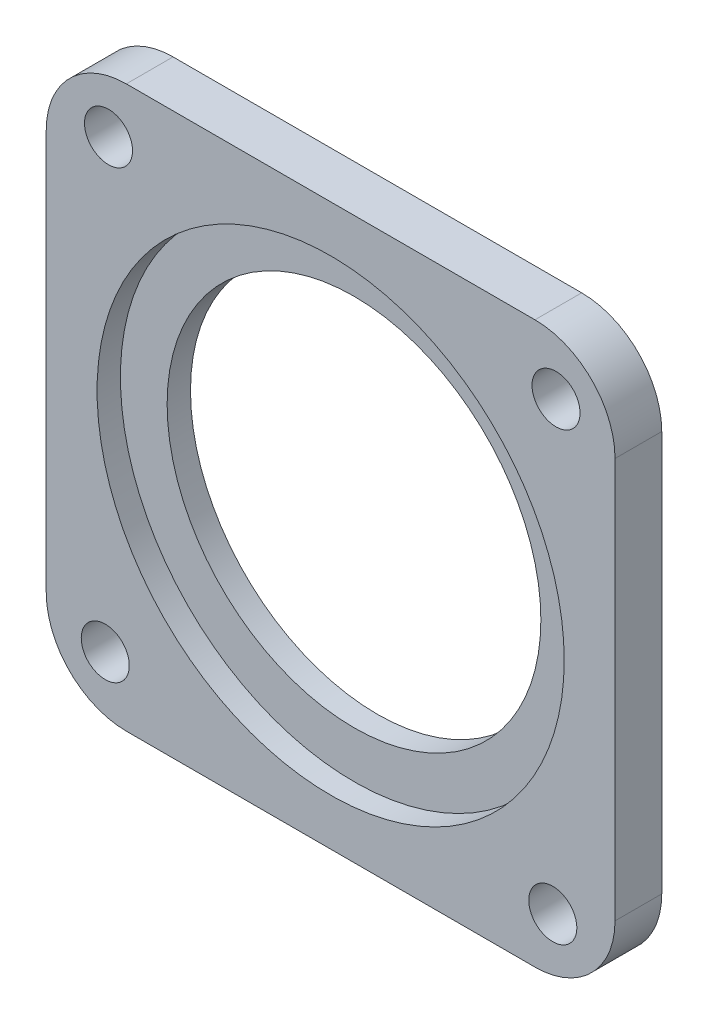
ISO-10303-21;
HEADER;
FILE_DESCRIPTION(('STEP AP214'),'2;1');
FILE_NAME('part.step','',(''),(''),'','','');
FILE_SCHEMA(('AUTOMOTIVE_DESIGN { 1 0 10303 214 1 1 1 1 }'));
ENDSEC;
DATA;
#1=APPLICATION_CONTEXT('core data for automotive mechanical design processes');
#2=APPLICATION_PROTOCOL_DEFINITION('international standard','automotive_design',2000,#1);
#3=PRODUCT_CONTEXT('',#1,'mechanical');
#4=PRODUCT('Part','Part','',(#3));
#5=PRODUCT_RELATED_PRODUCT_CATEGORY('part','',(#4));
#6=PRODUCT_DEFINITION_FORMATION('','',#4);
#7=PRODUCT_DEFINITION_CONTEXT('part definition',#1,'design');
#8=PRODUCT_DEFINITION('design','',#6,#7);
#9=PRODUCT_DEFINITION_SHAPE('','',#8);
#10=(LENGTH_UNIT() NAMED_UNIT(*) SI_UNIT(.MILLI.,.METRE.));
#11=(NAMED_UNIT(*) PLANE_ANGLE_UNIT() SI_UNIT($,.RADIAN.));
#12=(NAMED_UNIT(*) SI_UNIT($,.STERADIAN.) SOLID_ANGLE_UNIT());
#13=UNCERTAINTY_MEASURE_WITH_UNIT(LENGTH_MEASURE(1.E-05),#10,'distance_accuracy_value','');
#14=(GEOMETRIC_REPRESENTATION_CONTEXT(3) GLOBAL_UNCERTAINTY_ASSIGNED_CONTEXT((#13)) GLOBAL_UNIT_ASSIGNED_CONTEXT((#10,
#11,#12)) REPRESENTATION_CONTEXT('',''));
#15=CARTESIAN_POINT('',(0.,0.,0.));
#16=DIRECTION('',(0.,0.,1.));
#17=DIRECTION('',(1.,0.,0.));
#18=AXIS2_PLACEMENT_3D('',#15,#16,#17);
#19=CARTESIAN_POINT('',(0.,0.,3.5));
#20=DIRECTION('',(0.,0.,-1.));
#21=DIRECTION('',(-1.,0.,0.));
#22=AXIS2_PLACEMENT_3D('',#19,#20,#21);
#23=CYLINDRICAL_SURFACE('',#22,14.);
#24=CARTESIAN_POINT('',(0.,0.,0.));
#25=DIRECTION('',(0.,0.,1.));
#26=DIRECTION('',(1.,0.,0.));
#27=AXIS2_PLACEMENT_3D('',#24,#25,#26);
#28=CIRCLE('',#27,14.);
#29=CARTESIAN_POINT('',(14.,0.,0.));
#30=VERTEX_POINT('',#29);
#31=EDGE_CURVE('E127',#30,#30,#28,.T.);
#32=ORIENTED_EDGE('',*,*,#31,.F.);
#33=EDGE_LOOP('',(#32));
#34=FACE_BOUND('',#33,.T.);
#35=CARTESIAN_POINT('',(0.,0.,1.75));
#36=DIRECTION('',(0.,0.,1.));
#37=DIRECTION('',(1.,0.,0.));
#38=AXIS2_PLACEMENT_3D('',#35,#36,#37);
#39=CIRCLE('',#38,14.);
#40=CARTESIAN_POINT('',(14.,0.,1.75));
#41=VERTEX_POINT('',#40);
#42=EDGE_CURVE('E133',#41,#41,#39,.T.);
#43=ORIENTED_EDGE('',*,*,#42,.T.);
#44=EDGE_LOOP('',(#43));
#45=FACE_BOUND('',#44,.T.);
#46=ADVANCED_FACE('F33',(#34,#45),#23,.F.);
#47=CARTESIAN_POINT('',(0.,0.,3.5));
#48=DIRECTION('',(0.,0.,1.));
#49=DIRECTION('',(1.,0.,0.));
#50=AXIS2_PLACEMENT_3D('',#47,#48,#49);
#51=PLANE('',#50);
#52=CARTESIAN_POINT('',(16.8856216883251,16.6420790678204,3.5));
#53=DIRECTION('',(0.,0.,-1.));
#54=DIRECTION('',(-1.,0.,0.));
#55=AXIS2_PLACEMENT_3D('',#52,#53,#54);
#56=CIRCLE('',#55,1.8);
#57=CARTESIAN_POINT('',(15.0856216883251,16.6420790678204,3.5));
#58=VERTEX_POINT('',#57);
#59=EDGE_CURVE('E206',#58,#58,#56,.T.);
#60=ORIENTED_EDGE('',*,*,#59,.T.);
#61=EDGE_LOOP('',(#60));
#62=FACE_BOUND('',#61,.T.);
#63=CARTESIAN_POINT('',(-16.6420790678204,16.8856216883261,3.5));
#64=DIRECTION('',(0.,0.,-1.));
#65=DIRECTION('',(-1.,0.,0.));
#66=AXIS2_PLACEMENT_3D('',#63,#64,#65);
#67=CIRCLE('',#66,1.8);
#68=CARTESIAN_POINT('',(-18.4420790678204,16.8856216883261,3.5));
#69=VERTEX_POINT('',#68);
#70=EDGE_CURVE('E200',#69,#69,#67,.T.);
#71=ORIENTED_EDGE('',*,*,#70,.T.);
#72=EDGE_LOOP('',(#71));
#73=FACE_BOUND('',#72,.T.);
#74=CARTESIAN_POINT('',(-16.8856216883261,-16.6420790678195,3.5));
#75=DIRECTION('',(0.,0.,-1.));
#76=DIRECTION('',(-1.,0.,0.));
#77=AXIS2_PLACEMENT_3D('',#74,#75,#76);
#78=CIRCLE('',#77,1.8);
#79=CARTESIAN_POINT('',(-18.6856216883261,-16.6420790678195,3.5));
#80=VERTEX_POINT('',#79);
#81=EDGE_CURVE('E194',#80,#80,#78,.T.);
#82=ORIENTED_EDGE('',*,*,#81,.T.);
#83=EDGE_LOOP('',(#82));
#84=FACE_BOUND('',#83,.T.);
#85=CARTESIAN_POINT('',(16.6420790678195,-16.8856216883251,3.5));
#86=DIRECTION('',(0.,0.,-1.));
#87=DIRECTION('',(-1.,0.,0.));
#88=AXIS2_PLACEMENT_3D('',#85,#86,#87);
#89=CIRCLE('',#88,1.8);
#90=CARTESIAN_POINT('',(14.8420790678195,-16.8856216883251,3.5));
#91=VERTEX_POINT('',#90);
#92=EDGE_CURVE('E186',#91,#91,#89,.T.);
#93=ORIENTED_EDGE('',*,*,#92,.T.);
#94=EDGE_LOOP('',(#93));
#95=FACE_BOUND('',#94,.T.);
#96=CARTESIAN_POINT('',(0.,0.,3.5));
#97=DIRECTION('',(0.,0.,1.));
#98=DIRECTION('',(1.,0.,0.));
#99=AXIS2_PLACEMENT_3D('',#96,#97,#98);
#100=CIRCLE('',#99,17.5);
#101=CARTESIAN_POINT('',(17.5,0.,3.5));
#102=VERTEX_POINT('',#101);
#103=EDGE_CURVE('E183',#102,#102,#100,.T.);
#104=ORIENTED_EDGE('',*,*,#103,.F.);
#105=EDGE_LOOP('',(#104));
#106=FACE_BOUND('',#105,.T.);
#107=DIRECTION('',(-1.,0.,0.));
#108=VECTOR('',#107,1.);
#109=CARTESIAN_POINT('',(21.3073170731708,21.,3.5));
#110=LINE('',#109,#108);
#111=CARTESIAN_POINT('',(15.3073170731708,21.,3.5));
#112=VERTEX_POINT('',#111);
#113=CARTESIAN_POINT('',(-15.3073170731708,21.,3.5));
#114=VERTEX_POINT('',#113);
#115=EDGE_CURVE('E136',#112,#114,#110,.T.);
#116=ORIENTED_EDGE('',*,*,#115,.T.);
#117=CARTESIAN_POINT('',(-15.3073170731708,15.,3.5));
#118=DIRECTION('',(0.,0.,1.));
#119=DIRECTION('',(1.,0.,0.));
#120=AXIS2_PLACEMENT_3D('',#117,#118,#119);
#121=CIRCLE('',#120,6.);
#122=CARTESIAN_POINT('',(-21.3073170731708,15.,3.5));
#123=VERTEX_POINT('',#122);
#124=EDGE_CURVE('E158',#114,#123,#121,.T.);
#125=ORIENTED_EDGE('',*,*,#124,.T.);
#126=DIRECTION('',(0.,-1.,0.));
#127=VECTOR('',#126,1.);
#128=CARTESIAN_POINT('',(-21.3073170731708,-21.,3.5));
#129=LINE('',#128,#127);
#130=CARTESIAN_POINT('',(-21.3073170731708,-15.,3.5));
#131=VERTEX_POINT('',#130);
#132=EDGE_CURVE('E119',#123,#131,#129,.T.);
#133=ORIENTED_EDGE('',*,*,#132,.T.);
#134=CARTESIAN_POINT('',(-15.3073170731708,-15.,3.5));
#135=DIRECTION('',(0.,0.,1.));
#136=DIRECTION('',(1.,0.,0.));
#137=AXIS2_PLACEMENT_3D('',#134,#135,#136);
#138=CIRCLE('',#137,6.);
#139=CARTESIAN_POINT('',(-15.3073170731708,-21.,3.5));
#140=VERTEX_POINT('',#139);
#141=EDGE_CURVE('E156',#131,#140,#138,.T.);
#142=ORIENTED_EDGE('',*,*,#141,.T.);
#143=DIRECTION('',(1.,0.,0.));
#144=VECTOR('',#143,1.);
#145=CARTESIAN_POINT('',(21.3073170731708,-21.,3.5));
#146=LINE('',#145,#144);
#147=CARTESIAN_POINT('',(15.3073170731708,-21.,3.5));
#148=VERTEX_POINT('',#147);
#149=EDGE_CURVE('E169',#140,#148,#146,.T.);
#150=ORIENTED_EDGE('',*,*,#149,.T.);
#151=CARTESIAN_POINT('',(15.3073170731708,-15.,3.5));
#152=DIRECTION('',(0.,0.,1.));
#153=DIRECTION('',(1.,0.,0.));
#154=AXIS2_PLACEMENT_3D('',#151,#152,#153);
#155=CIRCLE('',#154,6.);
#156=CARTESIAN_POINT('',(21.3073170731708,-15.,3.5));
#157=VERTEX_POINT('',#156);
#158=EDGE_CURVE('E54',#148,#157,#155,.T.);
#159=ORIENTED_EDGE('',*,*,#158,.T.);
#160=DIRECTION('',(0.,1.,0.));
#161=VECTOR('',#160,1.);
#162=CARTESIAN_POINT('',(21.3073170731708,-21.,3.5));
#163=LINE('',#162,#161);
#164=CARTESIAN_POINT('',(21.3073170731708,15.,3.5));
#165=VERTEX_POINT('',#164);
#166=EDGE_CURVE('E177',#157,#165,#163,.T.);
#167=ORIENTED_EDGE('',*,*,#166,.T.);
#168=CARTESIAN_POINT('',(15.3073170731708,15.,3.5));
#169=DIRECTION('',(0.,0.,1.));
#170=DIRECTION('',(1.,0.,0.));
#171=AXIS2_PLACEMENT_3D('',#168,#169,#170);
#172=CIRCLE('',#171,6.);
#173=EDGE_CURVE('E153',#165,#112,#172,.T.);
#174=ORIENTED_EDGE('',*,*,#173,.T.);
#175=EDGE_LOOP('',(#116,#125,#133,#142,#150,#159,#167,#174));
#176=FACE_BOUND('',#175,.T.);
#177=ADVANCED_FACE('F217',(#62,#73,#84,#95,#106,#176),#51,.T.);
#178=CARTESIAN_POINT('',(0.,0.,0.));
#179=DIRECTION('',(0.,0.,1.));
#180=DIRECTION('',(1.,0.,0.));
#181=AXIS2_PLACEMENT_3D('',#178,#179,#180);
#182=PLANE('',#181);
#183=CARTESIAN_POINT('',(16.8856216883251,16.6420790678204,0.));
#184=DIRECTION('',(0.,0.,-1.));
#185=DIRECTION('',(-1.,0.,0.));
#186=AXIS2_PLACEMENT_3D('',#183,#184,#185);
#187=CIRCLE('',#186,1.8);
#188=CARTESIAN_POINT('',(15.0856216883251,16.6420790678204,0.));
#189=VERTEX_POINT('',#188);
#190=EDGE_CURVE('E209',#189,#189,#187,.T.);
#191=ORIENTED_EDGE('',*,*,#190,.F.);
#192=EDGE_LOOP('',(#191));
#193=FACE_BOUND('',#192,.T.);
#194=CARTESIAN_POINT('',(-16.6420790678204,16.8856216883261,0.));
#195=DIRECTION('',(0.,0.,-1.));
#196=DIRECTION('',(-1.,0.,0.));
#197=AXIS2_PLACEMENT_3D('',#194,#195,#196);
#198=CIRCLE('',#197,1.8);
#199=CARTESIAN_POINT('',(-18.4420790678204,16.8856216883261,0.));
#200=VERTEX_POINT('',#199);
#201=EDGE_CURVE('E203',#200,#200,#198,.T.);
#202=ORIENTED_EDGE('',*,*,#201,.F.);
#203=EDGE_LOOP('',(#202));
#204=FACE_BOUND('',#203,.T.);
#205=CARTESIAN_POINT('',(-16.8856216883261,-16.6420790678195,0.));
#206=DIRECTION('',(0.,0.,-1.));
#207=DIRECTION('',(-1.,0.,0.));
#208=AXIS2_PLACEMENT_3D('',#205,#206,#207);
#209=CIRCLE('',#208,1.8);
#210=CARTESIAN_POINT('',(-18.6856216883261,-16.6420790678195,0.));
#211=VERTEX_POINT('',#210);
#212=EDGE_CURVE('E197',#211,#211,#209,.T.);
#213=ORIENTED_EDGE('',*,*,#212,.F.);
#214=EDGE_LOOP('',(#213));
#215=FACE_BOUND('',#214,.T.);
#216=CARTESIAN_POINT('',(16.6420790678195,-16.8856216883251,0.));
#217=DIRECTION('',(0.,0.,-1.));
#218=DIRECTION('',(-1.,0.,0.));
#219=AXIS2_PLACEMENT_3D('',#216,#217,#218);
#220=CIRCLE('',#219,1.8);
#221=CARTESIAN_POINT('',(14.8420790678195,-16.8856216883251,0.));
#222=VERTEX_POINT('',#221);
#223=EDGE_CURVE('E191',#222,#222,#220,.T.);
#224=ORIENTED_EDGE('',*,*,#223,.F.);
#225=EDGE_LOOP('',(#224));
#226=FACE_BOUND('',#225,.T.);
#227=DIRECTION('',(0.,-1.,0.));
#228=VECTOR('',#227,1.);
#229=CARTESIAN_POINT('',(-21.3073170731708,-21.,0.));
#230=LINE('',#229,#228);
#231=CARTESIAN_POINT('',(-21.3073170731708,15.,0.));
#232=VERTEX_POINT('',#231);
#233=CARTESIAN_POINT('',(-21.3073170731708,-15.,0.));
#234=VERTEX_POINT('',#233);
#235=EDGE_CURVE('E116',#232,#234,#230,.T.);
#236=ORIENTED_EDGE('',*,*,#235,.F.);
#237=CARTESIAN_POINT('',(-15.3073170731708,15.,0.));
#238=DIRECTION('',(0.,0.,1.));
#239=DIRECTION('',(1.,0.,0.));
#240=AXIS2_PLACEMENT_3D('',#237,#238,#239);
#241=CIRCLE('',#240,6.);
#242=CARTESIAN_POINT('',(-15.3073170731708,21.,0.));
#243=VERTEX_POINT('',#242);
#244=EDGE_CURVE('E99',#232,#243,#241,.F.);
#245=ORIENTED_EDGE('',*,*,#244,.T.);
#246=DIRECTION('',(-1.,0.,0.));
#247=VECTOR('',#246,1.);
#248=CARTESIAN_POINT('',(21.3073170731708,21.,0.));
#249=LINE('',#248,#247);
#250=CARTESIAN_POINT('',(15.3073170731708,21.,0.));
#251=VERTEX_POINT('',#250);
#252=EDGE_CURVE('E140',#251,#243,#249,.T.);
#253=ORIENTED_EDGE('',*,*,#252,.F.);
#254=CARTESIAN_POINT('',(15.3073170731708,15.,0.));
#255=DIRECTION('',(0.,0.,1.));
#256=DIRECTION('',(1.,0.,0.));
#257=AXIS2_PLACEMENT_3D('',#254,#255,#256);
#258=CIRCLE('',#257,6.);
#259=CARTESIAN_POINT('',(21.3073170731708,15.,0.));
#260=VERTEX_POINT('',#259);
#261=EDGE_CURVE('E120',#251,#260,#258,.F.);
#262=ORIENTED_EDGE('',*,*,#261,.T.);
#263=DIRECTION('',(0.,1.,0.));
#264=VECTOR('',#263,1.);
#265=CARTESIAN_POINT('',(21.3073170731708,-21.,0.));
#266=LINE('',#265,#264);
#267=CARTESIAN_POINT('',(21.3073170731708,-15.,0.));
#268=VERTEX_POINT('',#267);
#269=EDGE_CURVE('E130',#268,#260,#266,.T.);
#270=ORIENTED_EDGE('',*,*,#269,.F.);
#271=CARTESIAN_POINT('',(15.3073170731708,-15.,0.));
#272=DIRECTION('',(0.,0.,1.));
#273=DIRECTION('',(1.,0.,0.));
#274=AXIS2_PLACEMENT_3D('',#271,#272,#273);
#275=CIRCLE('',#274,6.);
#276=CARTESIAN_POINT('',(15.3073170731708,-21.,0.));
#277=VERTEX_POINT('',#276);
#278=EDGE_CURVE('E147',#268,#277,#275,.F.);
#279=ORIENTED_EDGE('',*,*,#278,.T.);
#280=DIRECTION('',(1.,0.,0.));
#281=VECTOR('',#280,1.);
#282=CARTESIAN_POINT('',(21.3073170731708,-21.,0.));
#283=LINE('',#282,#281);
#284=CARTESIAN_POINT('',(-15.3073170731708,-21.,0.));
#285=VERTEX_POINT('',#284);
#286=EDGE_CURVE('E126',#285,#277,#283,.T.);
#287=ORIENTED_EDGE('',*,*,#286,.F.);
#288=CARTESIAN_POINT('',(-15.3073170731708,-15.,0.));
#289=DIRECTION('',(0.,0.,1.));
#290=DIRECTION('',(1.,0.,0.));
#291=AXIS2_PLACEMENT_3D('',#288,#289,#290);
#292=CIRCLE('',#291,6.);
#293=EDGE_CURVE('E110',#285,#234,#292,.F.);
#294=ORIENTED_EDGE('',*,*,#293,.T.);
#295=EDGE_LOOP('',(#236,#245,#253,#262,#270,#279,#287,#294));
#296=FACE_BOUND('',#295,.T.);
#297=ORIENTED_EDGE('',*,*,#31,.T.);
#298=EDGE_LOOP('',(#297));
#299=FACE_BOUND('',#298,.T.);
#300=ADVANCED_FACE('F123',(#193,#204,#215,#226,#296,#299),#182,.F.);
#301=CARTESIAN_POINT('',(-21.3073170731708,-21.,3.5));
#302=DIRECTION('',(1.,0.,0.));
#303=DIRECTION('',(0.,0.,-1.));
#304=AXIS2_PLACEMENT_3D('',#301,#302,#303);
#305=PLANE('',#304);
#306=ORIENTED_EDGE('',*,*,#132,.F.);
#307=DIRECTION('',(0.,0.,-1.));
#308=VECTOR('',#307,1.);
#309=CARTESIAN_POINT('',(-21.3073170731708,15.,3.5));
#310=LINE('',#309,#308);
#311=EDGE_CURVE('E103',#123,#232,#310,.T.);
#312=ORIENTED_EDGE('',*,*,#311,.T.);
#313=ORIENTED_EDGE('',*,*,#235,.T.);
#314=DIRECTION('',(0.,0.,-1.));
#315=VECTOR('',#314,1.);
#316=CARTESIAN_POINT('',(-21.3073170731708,-15.,3.5));
#317=LINE('',#316,#315);
#318=EDGE_CURVE('E121',#234,#131,#317,.F.);
#319=ORIENTED_EDGE('',*,*,#318,.T.);
#320=EDGE_LOOP('',(#306,#312,#313,#319));
#321=FACE_BOUND('',#320,.T.);
#322=ADVANCED_FACE('F115',(#321),#305,.F.);
#323=CARTESIAN_POINT('',(21.3073170731708,-21.,3.5));
#324=DIRECTION('',(0.,1.,0.));
#325=DIRECTION('',(-1.,0.,0.));
#326=AXIS2_PLACEMENT_3D('',#323,#324,#325);
#327=PLANE('',#326);
#328=ORIENTED_EDGE('',*,*,#149,.F.);
#329=DIRECTION('',(0.,0.,-1.));
#330=VECTOR('',#329,1.);
#331=CARTESIAN_POINT('',(-15.3073170731708,-21.,3.5));
#332=LINE('',#331,#330);
#333=EDGE_CURVE('E162',#140,#285,#332,.T.);
#334=ORIENTED_EDGE('',*,*,#333,.T.);
#335=ORIENTED_EDGE('',*,*,#286,.T.);
#336=DIRECTION('',(0.,0.,-1.));
#337=VECTOR('',#336,1.);
#338=CARTESIAN_POINT('',(15.3073170731708,-21.,3.5));
#339=LINE('',#338,#337);
#340=EDGE_CURVE('E160',#277,#148,#339,.F.);
#341=ORIENTED_EDGE('',*,*,#340,.T.);
#342=EDGE_LOOP('',(#328,#334,#335,#341));
#343=FACE_BOUND('',#342,.T.);
#344=ADVANCED_FACE('F167',(#343),#327,.F.);
#345=CARTESIAN_POINT('',(21.3073170731708,-21.,3.5));
#346=DIRECTION('',(-1.,0.,0.));
#347=DIRECTION('',(0.,0.,1.));
#348=AXIS2_PLACEMENT_3D('',#345,#346,#347);
#349=PLANE('',#348);
#350=ORIENTED_EDGE('',*,*,#166,.F.);
#351=DIRECTION('',(0.,0.,-1.));
#352=VECTOR('',#351,1.);
#353=CARTESIAN_POINT('',(21.3073170731708,-15.,3.5));
#354=LINE('',#353,#352);
#355=EDGE_CURVE('E11',#157,#268,#354,.T.);
#356=ORIENTED_EDGE('',*,*,#355,.T.);
#357=ORIENTED_EDGE('',*,*,#269,.T.);
#358=DIRECTION('',(0.,0.,-1.));
#359=VECTOR('',#358,1.);
#360=CARTESIAN_POINT('',(21.3073170731708,15.,3.5));
#361=LINE('',#360,#359);
#362=EDGE_CURVE('E41',#260,#165,#361,.F.);
#363=ORIENTED_EDGE('',*,*,#362,.T.);
#364=EDGE_LOOP('',(#350,#356,#357,#363));
#365=FACE_BOUND('',#364,.T.);
#366=ADVANCED_FACE('F176',(#365),#349,.F.);
#367=CARTESIAN_POINT('',(21.3073170731708,21.,3.5));
#368=DIRECTION('',(0.,-1.,0.));
#369=DIRECTION('',(1.,0.,0.));
#370=AXIS2_PLACEMENT_3D('',#367,#368,#369);
#371=PLANE('',#370);
#372=ORIENTED_EDGE('',*,*,#252,.T.);
#373=DIRECTION('',(0.,0.,-1.));
#374=VECTOR('',#373,1.);
#375=CARTESIAN_POINT('',(-15.3073170731708,21.,3.5));
#376=LINE('',#375,#374);
#377=EDGE_CURVE('E104',#243,#114,#376,.F.);
#378=ORIENTED_EDGE('',*,*,#377,.T.);
#379=ORIENTED_EDGE('',*,*,#115,.F.);
#380=DIRECTION('',(0.,0.,-1.));
#381=VECTOR('',#380,1.);
#382=CARTESIAN_POINT('',(15.3073170731708,21.,3.5));
#383=LINE('',#382,#381);
#384=EDGE_CURVE('E109',#112,#251,#383,.T.);
#385=ORIENTED_EDGE('',*,*,#384,.T.);
#386=EDGE_LOOP('',(#372,#378,#379,#385));
#387=FACE_BOUND('',#386,.T.);
#388=ADVANCED_FACE('F254',(#387),#371,.F.);
#389=CARTESIAN_POINT('',(0.,0.,1.75));
#390=DIRECTION('',(0.,0.,1.));
#391=DIRECTION('',(1.,0.,0.));
#392=AXIS2_PLACEMENT_3D('',#389,#390,#391);
#393=CYLINDRICAL_SURFACE('',#392,17.5);
#394=CARTESIAN_POINT('',(0.,0.,1.75));
#395=DIRECTION('',(0.,0.,1.));
#396=DIRECTION('',(1.,0.,0.));
#397=AXIS2_PLACEMENT_3D('',#394,#395,#396);
#398=CIRCLE('',#397,17.5);
#399=CARTESIAN_POINT('',(17.5,0.,1.75));
#400=VERTEX_POINT('',#399);
#401=EDGE_CURVE('E144',#400,#400,#398,.T.);
#402=ORIENTED_EDGE('',*,*,#401,.F.);
#403=EDGE_LOOP('',(#402));
#404=FACE_BOUND('',#403,.T.);
#405=ORIENTED_EDGE('',*,*,#103,.T.);
#406=EDGE_LOOP('',(#405));
#407=FACE_BOUND('',#406,.T.);
#408=ADVANCED_FACE('F238',(#404,#407),#393,.F.);
#409=CARTESIAN_POINT('',(0.,0.,1.75));
#410=DIRECTION('',(0.,0.,1.));
#411=DIRECTION('',(1.,0.,0.));
#412=AXIS2_PLACEMENT_3D('',#409,#410,#411);
#413=PLANE('',#412);
#414=ORIENTED_EDGE('',*,*,#42,.F.);
#415=EDGE_LOOP('',(#414));
#416=FACE_BOUND('',#415,.T.);
#417=ORIENTED_EDGE('',*,*,#401,.T.);
#418=EDGE_LOOP('',(#417));
#419=FACE_BOUND('',#418,.T.);
#420=ADVANCED_FACE('F228',(#416,#419),#413,.T.);
#421=CARTESIAN_POINT('',(16.6420790678195,-16.8856216883251,0.));
#422=DIRECTION('',(0.,0.,-1.));
#423=DIRECTION('',(-1.,0.,0.));
#424=AXIS2_PLACEMENT_3D('',#421,#422,#423);
#425=CYLINDRICAL_SURFACE('',#424,1.8);
#426=ORIENTED_EDGE('',*,*,#92,.F.);
#427=EDGE_LOOP('',(#426));
#428=FACE_BOUND('',#427,.T.);
#429=ORIENTED_EDGE('',*,*,#223,.T.);
#430=EDGE_LOOP('',(#429));
#431=FACE_BOUND('',#430,.T.);
#432=ADVANCED_FACE('F225',(#428,#431),#425,.F.);
#433=CARTESIAN_POINT('',(-16.8856216883261,-16.6420790678195,0.));
#434=DIRECTION('',(0.,0.,-1.));
#435=DIRECTION('',(-1.,0.,0.));
#436=AXIS2_PLACEMENT_3D('',#433,#434,#435);
#437=CYLINDRICAL_SURFACE('',#436,1.8);
#438=ORIENTED_EDGE('',*,*,#81,.F.);
#439=EDGE_LOOP('',(#438));
#440=FACE_BOUND('',#439,.T.);
#441=ORIENTED_EDGE('',*,*,#212,.T.);
#442=EDGE_LOOP('',(#441));
#443=FACE_BOUND('',#442,.T.);
#444=ADVANCED_FACE('F227',(#440,#443),#437,.F.);
#445=CARTESIAN_POINT('',(-16.6420790678204,16.8856216883261,0.));
#446=DIRECTION('',(0.,0.,-1.));
#447=DIRECTION('',(-1.,0.,0.));
#448=AXIS2_PLACEMENT_3D('',#445,#446,#447);
#449=CYLINDRICAL_SURFACE('',#448,1.8);
#450=ORIENTED_EDGE('',*,*,#70,.F.);
#451=EDGE_LOOP('',(#450));
#452=FACE_BOUND('',#451,.T.);
#453=ORIENTED_EDGE('',*,*,#201,.T.);
#454=EDGE_LOOP('',(#453));
#455=FACE_BOUND('',#454,.T.);
#456=ADVANCED_FACE('F235',(#452,#455),#449,.F.);
#457=CARTESIAN_POINT('',(16.8856216883251,16.6420790678204,0.));
#458=DIRECTION('',(0.,0.,-1.));
#459=DIRECTION('',(-1.,0.,0.));
#460=AXIS2_PLACEMENT_3D('',#457,#458,#459);
#461=CYLINDRICAL_SURFACE('',#460,1.8);
#462=ORIENTED_EDGE('',*,*,#59,.F.);
#463=EDGE_LOOP('',(#462));
#464=FACE_BOUND('',#463,.T.);
#465=ORIENTED_EDGE('',*,*,#190,.T.);
#466=EDGE_LOOP('',(#465));
#467=FACE_BOUND('',#466,.T.);
#468=ADVANCED_FACE('F213',(#464,#467),#461,.F.);
#469=CARTESIAN_POINT('',(-15.3073170731708,15.,3.5));
#470=DIRECTION('',(0.,0.,-1.));
#471=DIRECTION('',(-1.,0.,0.));
#472=AXIS2_PLACEMENT_3D('',#469,#470,#471);
#473=CYLINDRICAL_SURFACE('',#472,6.);
#474=ORIENTED_EDGE('',*,*,#124,.F.);
#475=ORIENTED_EDGE('',*,*,#377,.F.);
#476=ORIENTED_EDGE('',*,*,#244,.F.);
#477=ORIENTED_EDGE('',*,*,#311,.F.);
#478=EDGE_LOOP('',(#474,#475,#476,#477));
#479=FACE_BOUND('',#478,.T.);
#480=ADVANCED_FACE('F102',(#479),#473,.T.);
#481=CARTESIAN_POINT('',(-15.3073170731708,-15.,3.5));
#482=DIRECTION('',(0.,0.,-1.));
#483=DIRECTION('',(-1.,0.,0.));
#484=AXIS2_PLACEMENT_3D('',#481,#482,#483);
#485=CYLINDRICAL_SURFACE('',#484,6.);
#486=ORIENTED_EDGE('',*,*,#141,.F.);
#487=ORIENTED_EDGE('',*,*,#318,.F.);
#488=ORIENTED_EDGE('',*,*,#293,.F.);
#489=ORIENTED_EDGE('',*,*,#333,.F.);
#490=EDGE_LOOP('',(#486,#487,#488,#489));
#491=FACE_BOUND('',#490,.T.);
#492=ADVANCED_FACE('F266',(#491),#485,.T.);
#493=CARTESIAN_POINT('',(15.3073170731708,-15.,3.5));
#494=DIRECTION('',(0.,0.,-1.));
#495=DIRECTION('',(-1.,0.,0.));
#496=AXIS2_PLACEMENT_3D('',#493,#494,#495);
#497=CYLINDRICAL_SURFACE('',#496,6.);
#498=ORIENTED_EDGE('',*,*,#158,.F.);
#499=ORIENTED_EDGE('',*,*,#340,.F.);
#500=ORIENTED_EDGE('',*,*,#278,.F.);
#501=ORIENTED_EDGE('',*,*,#355,.F.);
#502=EDGE_LOOP('',(#498,#499,#500,#501));
#503=FACE_BOUND('',#502,.T.);
#504=ADVANCED_FACE('F175',(#503),#497,.T.);
#505=CARTESIAN_POINT('',(15.3073170731708,15.,3.5));
#506=DIRECTION('',(0.,0.,-1.));
#507=DIRECTION('',(-1.,0.,0.));
#508=AXIS2_PLACEMENT_3D('',#505,#506,#507);
#509=CYLINDRICAL_SURFACE('',#508,6.);
#510=ORIENTED_EDGE('',*,*,#173,.F.);
#511=ORIENTED_EDGE('',*,*,#362,.F.);
#512=ORIENTED_EDGE('',*,*,#261,.F.);
#513=ORIENTED_EDGE('',*,*,#384,.F.);
#514=EDGE_LOOP('',(#510,#511,#512,#513));
#515=FACE_BOUND('',#514,.T.);
#516=ADVANCED_FACE('F35',(#515),#509,.T.);
#517=CLOSED_SHELL('',(#46,#177,#300,#322,#344,#366,#388,#408,#420,#432,#444,#456,#468,#480,#492,
#504,#516));
#518=MANIFOLD_SOLID_BREP('B2',#517);
#519=ADVANCED_BREP_SHAPE_REPRESENTATION('',(#18,#518),#14);
#520=SHAPE_DEFINITION_REPRESENTATION(#9,#519);
ENDSEC;
END-ISO-10303-21;
